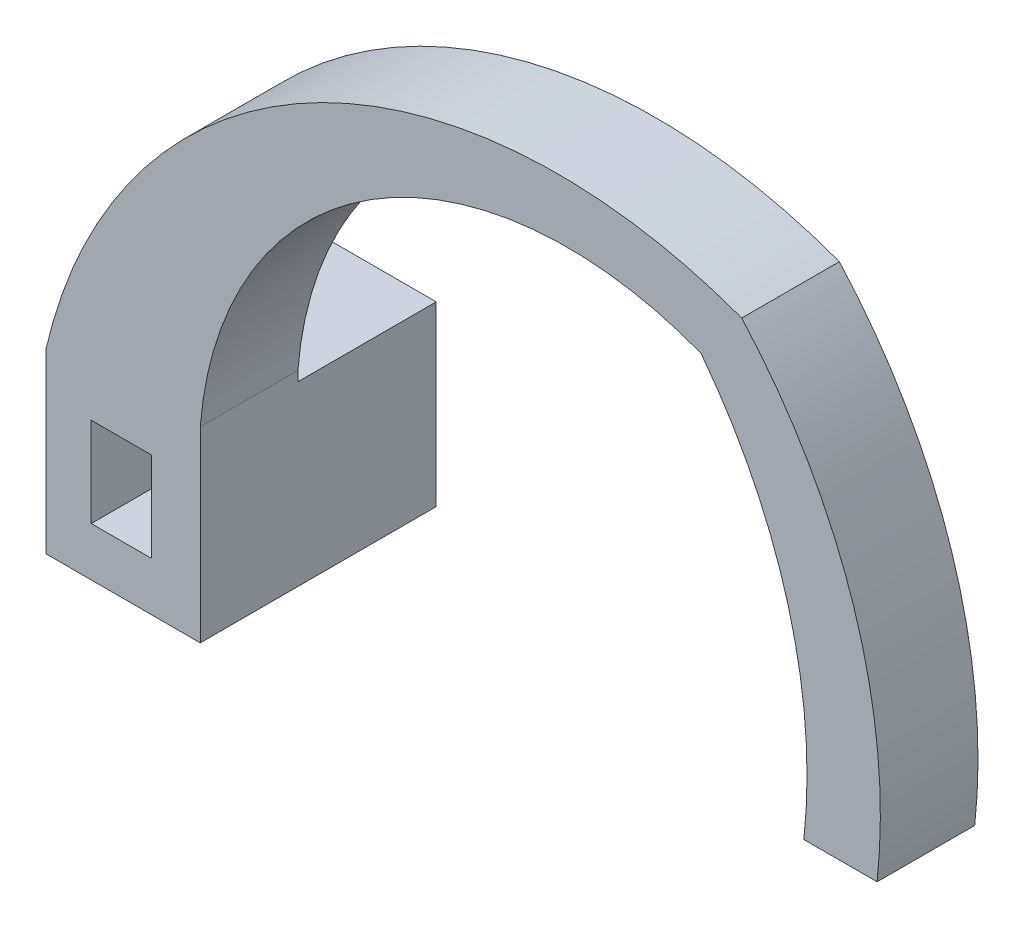
ISO-10303-21;
HEADER;
FILE_DESCRIPTION(('STEP AP214'),'2;1');
FILE_NAME('part.step','',(''),(''),'','','');
FILE_SCHEMA(('AUTOMOTIVE_DESIGN { 1 0 10303 214 1 1 1 1 }'));
ENDSEC;
DATA;
#1=APPLICATION_CONTEXT('core data for automotive mechanical design processes');
#2=APPLICATION_PROTOCOL_DEFINITION('international standard','automotive_design',2000,#1);
#3=PRODUCT_CONTEXT('',#1,'mechanical');
#4=PRODUCT('Part','Part','',(#3));
#5=PRODUCT_RELATED_PRODUCT_CATEGORY('part','',(#4));
#6=PRODUCT_DEFINITION_FORMATION('','',#4);
#7=PRODUCT_DEFINITION_CONTEXT('part definition',#1,'design');
#8=PRODUCT_DEFINITION('design','',#6,#7);
#9=PRODUCT_DEFINITION_SHAPE('','',#8);
#10=(LENGTH_UNIT() NAMED_UNIT(*) SI_UNIT(.MILLI.,.METRE.));
#11=(NAMED_UNIT(*) PLANE_ANGLE_UNIT() SI_UNIT($,.RADIAN.));
#12=(NAMED_UNIT(*) SI_UNIT($,.STERADIAN.) SOLID_ANGLE_UNIT());
#13=UNCERTAINTY_MEASURE_WITH_UNIT(LENGTH_MEASURE(1.E-05),#10,'distance_accuracy_value','');
#14=(GEOMETRIC_REPRESENTATION_CONTEXT(3) GLOBAL_UNCERTAINTY_ASSIGNED_CONTEXT((#13)) GLOBAL_UNIT_ASSIGNED_CONTEXT((#10,
#11,#12)) REPRESENTATION_CONTEXT('',''));
#15=CARTESIAN_POINT('',(0.,0.,0.));
#16=DIRECTION('',(0.,0.,1.));
#17=DIRECTION('',(1.,0.,0.));
#18=AXIS2_PLACEMENT_3D('',#15,#16,#17);
#19=CARTESIAN_POINT('',(26.8654364872377,-2.12640407016159,0.));
#20=DIRECTION('',(0.,0.,-1.));
#21=DIRECTION('',(-1.,0.,0.));
#22=AXIS2_PLACEMENT_3D('',#19,#20,#21);
#23=PLANE('',#22);
#24=DIRECTION('',(0.,1.,0.));
#25=VECTOR('',#24,1.);
#26=CARTESIAN_POINT('',(4.85,5.75,0.));
#27=LINE('',#26,#25);
#28=CARTESIAN_POINT('',(4.85,5.14865988453981,0.));
#29=VERTEX_POINT('',#28);
#30=CARTESIAN_POINT('',(4.85,5.75,0.));
#31=VERTEX_POINT('',#30);
#32=EDGE_CURVE('E141',#29,#31,#27,.T.);
#33=ORIENTED_EDGE('',*,*,#32,.F.);
#34=DIRECTION('',(-1.,0.,0.));
#35=VECTOR('',#34,1.);
#36=CARTESIAN_POINT('',(-4.62898705606322,5.14865988453981,0.));
#37=LINE('',#36,#35);
#38=CARTESIAN_POINT('',(-4.62898705606322,5.14865988453981,0.));
#39=VERTEX_POINT('',#38);
#40=EDGE_CURVE('E187',#29,#39,#37,.T.);
#41=ORIENTED_EDGE('',*,*,#40,.T.);
#42=CARTESIAN_POINT('',(26.8654364872377,-2.12640407016159,0.));
#43=DIRECTION('',(0.,0.,1.));
#44=DIRECTION('',(-1.,0.,0.));
#45=AXIS2_PLACEMENT_3D('',#42,#43,#44);
#46=CIRCLE('',#45,32.3237570506559);
#47=CARTESIAN_POINT('',(38.1232198948608,28.1735560390015,0.));
#48=VERTEX_POINT('',#47);
#49=EDGE_CURVE('E138',#48,#39,#46,.T.);
#50=ORIENTED_EDGE('',*,*,#49,.F.);
#51=CARTESIAN_POINT('',(13.4632041720986,5.97660619916421,0.));
#52=DIRECTION('',(0.,0.,1.));
#53=DIRECTION('',(1.,0.,0.));
#54=AXIS2_PLACEMENT_3D('',#51,#52,#53);
#55=CIRCLE('',#54,33.1786219972911);
#56=CARTESIAN_POINT('',(46.4407893159863,2.32971221705164,0.));
#57=VERTEX_POINT('',#56);
#58=EDGE_CURVE('E86',#57,#48,#55,.T.);
#59=ORIENTED_EDGE('',*,*,#58,.F.);
#60=DIRECTION('',(1.,0.,0.));
#61=VECTOR('',#60,1.);
#62=CARTESIAN_POINT('',(41.93897109,2.32971221705164,0.));
#63=LINE('',#62,#61);
#64=CARTESIAN_POINT('',(41.93897109,2.32971221705162,0.));
#65=VERTEX_POINT('',#64);
#66=EDGE_CURVE('E147',#65,#57,#63,.T.);
#67=ORIENTED_EDGE('',*,*,#66,.F.);
#68=CARTESIAN_POINT('',(10.5957900534776,5.84654599117634,0.));
#69=DIRECTION('',(0.,0.,-1.));
#70=DIRECTION('',(1.,0.,0.));
#71=AXIS2_PLACEMENT_3D('',#68,#69,#70);
#72=CIRCLE('',#71,31.539865524175);
#73=CARTESIAN_POINT('',(35.6198918729963,25.0443960116709,0.));
#74=VERTEX_POINT('',#73);
#75=EDGE_CURVE('E126',#74,#65,#72,.T.);
#76=ORIENTED_EDGE('',*,*,#75,.F.);
#77=CARTESIAN_POINT('',(27.4226515992907,3.93454709283099,0.));
#78=DIRECTION('',(0.,0.,-1.));
#79=DIRECTION('',(-1.,0.,0.));
#80=AXIS2_PLACEMENT_3D('',#77,#78,#79);
#81=CIRCLE('',#80,22.6455397259837);
#82=EDGE_CURVE('E144',#31,#74,#81,.T.);
#83=ORIENTED_EDGE('',*,*,#82,.F.);
#84=EDGE_LOOP('',(#33,#41,#50,#59,#67,#76,#83));
#85=FACE_BOUND('',#84,.T.);
#86=ADVANCED_FACE('F35',(#85),#23,.T.);
#87=CARTESIAN_POINT('',(26.8654364872377,-2.12640407016159,6.));
#88=DIRECTION('',(0.,0.,-1.));
#89=DIRECTION('',(-1.,0.,0.));
#90=AXIS2_PLACEMENT_3D('',#87,#88,#89);
#91=PLANE('',#90);
#92=CARTESIAN_POINT('',(26.8654364872377,-2.12640407016159,6.));
#93=DIRECTION('',(0.,0.,1.));
#94=DIRECTION('',(-1.,0.,0.));
#95=AXIS2_PLACEMENT_3D('',#92,#93,#94);
#96=CIRCLE('',#95,32.3237570506559);
#97=CARTESIAN_POINT('',(38.1232198948608,28.1735560390015,6.));
#98=VERTEX_POINT('',#97);
#99=CARTESIAN_POINT('',(-4.62898705606322,5.14865988453981,6.));
#100=VERTEX_POINT('',#99);
#101=EDGE_CURVE('E150',#98,#100,#96,.T.);
#102=ORIENTED_EDGE('',*,*,#101,.T.);
#103=DIRECTION('',(0.,-1.,0.));
#104=VECTOR('',#103,1.);
#105=CARTESIAN_POINT('',(-4.62898705606323,-5.75,6.));
#106=LINE('',#105,#104);
#107=CARTESIAN_POINT('',(-4.62898705606323,-5.75,6.));
#108=VERTEX_POINT('',#107);
#109=EDGE_CURVE('E94',#100,#108,#106,.T.);
#110=ORIENTED_EDGE('',*,*,#109,.T.);
#111=DIRECTION('',(1.,0.,0.));
#112=VECTOR('',#111,1.);
#113=CARTESIAN_POINT('',(4.85,-5.75,6.));
#114=LINE('',#113,#112);
#115=CARTESIAN_POINT('',(4.85,-5.75,6.));
#116=VERTEX_POINT('',#115);
#117=EDGE_CURVE('E169',#108,#116,#114,.T.);
#118=ORIENTED_EDGE('',*,*,#117,.T.);
#119=DIRECTION('',(0.,1.,0.));
#120=VECTOR('',#119,1.);
#121=CARTESIAN_POINT('',(4.85,5.75,6.));
#122=LINE('',#121,#120);
#123=CARTESIAN_POINT('',(4.85,5.75,6.));
#124=VERTEX_POINT('',#123);
#125=EDGE_CURVE('E224',#116,#124,#122,.T.);
#126=ORIENTED_EDGE('',*,*,#125,.T.);
#127=CARTESIAN_POINT('',(27.4226515992907,3.93454709283099,6.));
#128=DIRECTION('',(0.,0.,-1.));
#129=DIRECTION('',(-1.,0.,0.));
#130=AXIS2_PLACEMENT_3D('',#127,#128,#129);
#131=CIRCLE('',#130,22.6455397259837);
#132=CARTESIAN_POINT('',(35.6198918729963,25.0443960116709,6.));
#133=VERTEX_POINT('',#132);
#134=EDGE_CURVE('E117',#124,#133,#131,.T.);
#135=ORIENTED_EDGE('',*,*,#134,.T.);
#136=CARTESIAN_POINT('',(10.5957900534776,5.84654599117634,6.));
#137=DIRECTION('',(0.,0.,-1.));
#138=DIRECTION('',(1.,0.,0.));
#139=AXIS2_PLACEMENT_3D('',#136,#137,#138);
#140=CIRCLE('',#139,31.539865524175);
#141=CARTESIAN_POINT('',(41.93897109,2.32971221705162,6.));
#142=VERTEX_POINT('',#141);
#143=EDGE_CURVE('E109',#133,#142,#140,.T.);
#144=ORIENTED_EDGE('',*,*,#143,.T.);
#145=DIRECTION('',(1.,0.,0.));
#146=VECTOR('',#145,1.);
#147=CARTESIAN_POINT('',(41.93897109,2.32971221705164,6.));
#148=LINE('',#147,#146);
#149=CARTESIAN_POINT('',(46.4407893159863,2.32971221705164,6.));
#150=VERTEX_POINT('',#149);
#151=EDGE_CURVE('E114',#142,#150,#148,.T.);
#152=ORIENTED_EDGE('',*,*,#151,.T.);
#153=CARTESIAN_POINT('',(13.4632041720986,5.97660619916421,6.));
#154=DIRECTION('',(0.,0.,1.));
#155=DIRECTION('',(1.,0.,0.));
#156=AXIS2_PLACEMENT_3D('',#153,#154,#155);
#157=CIRCLE('',#156,33.1786219972911);
#158=EDGE_CURVE('E59',#150,#98,#157,.T.);
#159=ORIENTED_EDGE('',*,*,#158,.T.);
#160=EDGE_LOOP('',(#102,#110,#118,#126,#135,#144,#152,#159));
#161=FACE_BOUND('',#160,.T.);
#162=DIRECTION('',(0.,-1.,0.));
#163=VECTOR('',#162,1.);
#164=CARTESIAN_POINT('',(-1.85,2.75,6.));
#165=LINE('',#164,#163);
#166=CARTESIAN_POINT('',(-1.85,2.75,6.));
#167=VERTEX_POINT('',#166);
#168=CARTESIAN_POINT('',(-1.85,-2.75,6.));
#169=VERTEX_POINT('',#168);
#170=EDGE_CURVE('E200',#167,#169,#165,.T.);
#171=ORIENTED_EDGE('',*,*,#170,.F.);
#172=DIRECTION('',(-1.,0.,0.));
#173=VECTOR('',#172,1.);
#174=CARTESIAN_POINT('',(-1.85,2.75,6.));
#175=LINE('',#174,#173);
#176=CARTESIAN_POINT('',(1.85,2.75,6.));
#177=VERTEX_POINT('',#176);
#178=EDGE_CURVE('E210',#177,#167,#175,.T.);
#179=ORIENTED_EDGE('',*,*,#178,.F.);
#180=DIRECTION('',(0.,1.,0.));
#181=VECTOR('',#180,1.);
#182=CARTESIAN_POINT('',(1.85,2.75,6.));
#183=LINE('',#182,#181);
#184=CARTESIAN_POINT('',(1.85,-2.75,6.));
#185=VERTEX_POINT('',#184);
#186=EDGE_CURVE('E208',#185,#177,#183,.T.);
#187=ORIENTED_EDGE('',*,*,#186,.F.);
#188=DIRECTION('',(1.,0.,0.));
#189=VECTOR('',#188,1.);
#190=CARTESIAN_POINT('',(-1.85,-2.75,6.));
#191=LINE('',#190,#189);
#192=EDGE_CURVE('E205',#169,#185,#191,.T.);
#193=ORIENTED_EDGE('',*,*,#192,.F.);
#194=EDGE_LOOP('',(#171,#179,#187,#193));
#195=FACE_BOUND('',#194,.T.);
#196=ADVANCED_FACE('F111',(#161,#195),#91,.F.);
#197=CARTESIAN_POINT('',(26.8654364872377,-2.12640407016159,6.));
#198=DIRECTION('',(0.,0.,-1.));
#199=DIRECTION('',(-1.,0.,0.));
#200=AXIS2_PLACEMENT_3D('',#197,#198,#199);
#201=CYLINDRICAL_SURFACE('',#200,32.3237570506559);
#202=ORIENTED_EDGE('',*,*,#49,.T.);
#203=DIRECTION('',(0.,0.,-1.));
#204=VECTOR('',#203,1.);
#205=CARTESIAN_POINT('',(-4.62898705606322,5.14865988453981,6.));
#206=LINE('',#205,#204);
#207=EDGE_CURVE('E11',#100,#39,#206,.T.);
#208=ORIENTED_EDGE('',*,*,#207,.F.);
#209=ORIENTED_EDGE('',*,*,#101,.F.);
#210=DIRECTION('',(0.,0.,-1.));
#211=VECTOR('',#210,1.);
#212=CARTESIAN_POINT('',(38.1232198948608,28.1735560390015,6.));
#213=LINE('',#212,#211);
#214=EDGE_CURVE('E134',#98,#48,#213,.T.);
#215=ORIENTED_EDGE('',*,*,#214,.T.);
#216=EDGE_LOOP('',(#202,#208,#209,#215));
#217=FACE_BOUND('',#216,.T.);
#218=ADVANCED_FACE('F37',(#217),#201,.T.);
#219=CARTESIAN_POINT('',(-4.62898705606323,-5.75,6.));
#220=DIRECTION('',(1.,0.,0.));
#221=DIRECTION('',(0.,1.,0.));
#222=AXIS2_PLACEMENT_3D('',#219,#220,#221);
#223=PLANE('',#222);
#224=ORIENTED_EDGE('',*,*,#207,.T.);
#225=DIRECTION('',(0.,0.,1.));
#226=VECTOR('',#225,1.);
#227=CARTESIAN_POINT('',(-4.62898705606322,5.14865988453981,-8.5));
#228=LINE('',#227,#226);
#229=CARTESIAN_POINT('',(-4.62898705606322,5.14865988453981,-8.5));
#230=VERTEX_POINT('',#229);
#231=EDGE_CURVE('E186',#230,#39,#228,.T.);
#232=ORIENTED_EDGE('',*,*,#231,.F.);
#233=DIRECTION('',(0.,-1.,0.));
#234=VECTOR('',#233,1.);
#235=CARTESIAN_POINT('',(-4.62898705606323,-5.75,-8.5));
#236=LINE('',#235,#234);
#237=CARTESIAN_POINT('',(-4.62898705606323,-5.75,-8.5));
#238=VERTEX_POINT('',#237);
#239=EDGE_CURVE('E179',#230,#238,#236,.T.);
#240=ORIENTED_EDGE('',*,*,#239,.T.);
#241=DIRECTION('',(0.,0.,-1.));
#242=VECTOR('',#241,1.);
#243=CARTESIAN_POINT('',(-4.62898705606323,-5.75,6.));
#244=LINE('',#243,#242);
#245=EDGE_CURVE('E43',#108,#238,#244,.T.);
#246=ORIENTED_EDGE('',*,*,#245,.F.);
#247=ORIENTED_EDGE('',*,*,#109,.F.);
#248=EDGE_LOOP('',(#224,#232,#240,#246,#247));
#249=FACE_BOUND('',#248,.T.);
#250=ADVANCED_FACE('F185',(#249),#223,.F.);
#251=CARTESIAN_POINT('',(4.85,-5.75,6.));
#252=DIRECTION('',(0.,1.,0.));
#253=DIRECTION('',(0.,0.,1.));
#254=AXIS2_PLACEMENT_3D('',#251,#252,#253);
#255=PLANE('',#254);
#256=ORIENTED_EDGE('',*,*,#245,.T.);
#257=DIRECTION('',(1.,0.,0.));
#258=VECTOR('',#257,1.);
#259=CARTESIAN_POINT('',(-4.62898705606323,-5.75,-8.5));
#260=LINE('',#259,#258);
#261=CARTESIAN_POINT('',(4.85,-5.75,-8.5));
#262=VERTEX_POINT('',#261);
#263=EDGE_CURVE('E168',#238,#262,#260,.T.);
#264=ORIENTED_EDGE('',*,*,#263,.T.);
#265=DIRECTION('',(0.,0.,-1.));
#266=VECTOR('',#265,1.);
#267=CARTESIAN_POINT('',(4.85,-5.75,6.));
#268=LINE('',#267,#266);
#269=EDGE_CURVE('E157',#116,#262,#268,.T.);
#270=ORIENTED_EDGE('',*,*,#269,.F.);
#271=ORIENTED_EDGE('',*,*,#117,.F.);
#272=EDGE_LOOP('',(#256,#264,#270,#271));
#273=FACE_BOUND('',#272,.T.);
#274=ADVANCED_FACE('F165',(#273),#255,.F.);
#275=CARTESIAN_POINT('',(4.85,5.75,6.));
#276=DIRECTION('',(-1.,0.,0.));
#277=DIRECTION('',(0.,-1.,0.));
#278=AXIS2_PLACEMENT_3D('',#275,#276,#277);
#279=PLANE('',#278);
#280=ORIENTED_EDGE('',*,*,#269,.T.);
#281=DIRECTION('',(0.,1.,0.));
#282=VECTOR('',#281,1.);
#283=CARTESIAN_POINT('',(4.85,-5.75,-8.5));
#284=LINE('',#283,#282);
#285=CARTESIAN_POINT('',(4.85,5.14865988453981,-8.5));
#286=VERTEX_POINT('',#285);
#287=EDGE_CURVE('E182',#262,#286,#284,.T.);
#288=ORIENTED_EDGE('',*,*,#287,.T.);
#289=DIRECTION('',(0.,0.,1.));
#290=VECTOR('',#289,1.);
#291=CARTESIAN_POINT('',(4.85,5.14865988453981,-8.5));
#292=LINE('',#291,#290);
#293=EDGE_CURVE('E197',#286,#29,#292,.T.);
#294=ORIENTED_EDGE('',*,*,#293,.T.);
#295=ORIENTED_EDGE('',*,*,#32,.T.);
#296=DIRECTION('',(0.,0.,-1.));
#297=VECTOR('',#296,1.);
#298=CARTESIAN_POINT('',(4.85,5.75,6.));
#299=LINE('',#298,#297);
#300=EDGE_CURVE('E154',#124,#31,#299,.T.);
#301=ORIENTED_EDGE('',*,*,#300,.F.);
#302=ORIENTED_EDGE('',*,*,#125,.F.);
#303=EDGE_LOOP('',(#280,#288,#294,#295,#301,#302));
#304=FACE_BOUND('',#303,.T.);
#305=ADVANCED_FACE('F228',(#304),#279,.F.);
#306=CARTESIAN_POINT('',(27.4226515992907,3.93454709283099,6.));
#307=DIRECTION('',(0.,0.,-1.));
#308=DIRECTION('',(-1.,0.,0.));
#309=AXIS2_PLACEMENT_3D('',#306,#307,#308);
#310=CYLINDRICAL_SURFACE('',#309,22.6455397259837);
#311=ORIENTED_EDGE('',*,*,#82,.T.);
#312=DIRECTION('',(0.,0.,-1.));
#313=VECTOR('',#312,1.);
#314=CARTESIAN_POINT('',(35.6198918729963,25.0443960116709,6.));
#315=LINE('',#314,#313);
#316=EDGE_CURVE('E129',#133,#74,#315,.T.);
#317=ORIENTED_EDGE('',*,*,#316,.F.);
#318=ORIENTED_EDGE('',*,*,#134,.F.);
#319=ORIENTED_EDGE('',*,*,#300,.T.);
#320=EDGE_LOOP('',(#311,#317,#318,#319));
#321=FACE_BOUND('',#320,.T.);
#322=ADVANCED_FACE('F232',(#321),#310,.F.);
#323=CARTESIAN_POINT('',(10.5957900534776,5.84654599117634,6.));
#324=DIRECTION('',(0.,0.,-1.));
#325=DIRECTION('',(-1.,0.,0.));
#326=AXIS2_PLACEMENT_3D('',#323,#324,#325);
#327=CYLINDRICAL_SURFACE('',#326,31.539865524175);
#328=ORIENTED_EDGE('',*,*,#75,.T.);
#329=DIRECTION('',(0.,0.,-1.));
#330=VECTOR('',#329,1.);
#331=CARTESIAN_POINT('',(41.93897109,2.32971221705162,6.));
#332=LINE('',#331,#330);
#333=EDGE_CURVE('E123',#142,#65,#332,.T.);
#334=ORIENTED_EDGE('',*,*,#333,.F.);
#335=ORIENTED_EDGE('',*,*,#143,.F.);
#336=ORIENTED_EDGE('',*,*,#316,.T.);
#337=EDGE_LOOP('',(#328,#334,#335,#336));
#338=FACE_BOUND('',#337,.T.);
#339=ADVANCED_FACE('F124',(#338),#327,.F.);
#340=CARTESIAN_POINT('',(41.93897109,2.32971221705164,6.));
#341=DIRECTION('',(0.,1.,0.));
#342=DIRECTION('',(0.,0.,1.));
#343=AXIS2_PLACEMENT_3D('',#340,#341,#342);
#344=PLANE('',#343);
#345=ORIENTED_EDGE('',*,*,#66,.T.);
#346=DIRECTION('',(0.,0.,-1.));
#347=VECTOR('',#346,1.);
#348=CARTESIAN_POINT('',(46.4407893159863,2.32971221705164,6.));
#349=LINE('',#348,#347);
#350=EDGE_CURVE('E130',#150,#57,#349,.T.);
#351=ORIENTED_EDGE('',*,*,#350,.F.);
#352=ORIENTED_EDGE('',*,*,#151,.F.);
#353=ORIENTED_EDGE('',*,*,#333,.T.);
#354=EDGE_LOOP('',(#345,#351,#352,#353));
#355=FACE_BOUND('',#354,.T.);
#356=ADVANCED_FACE('F132',(#355),#344,.F.);
#357=CARTESIAN_POINT('',(13.4632041720986,5.97660619916421,6.));
#358=DIRECTION('',(0.,0.,-1.));
#359=DIRECTION('',(-1.,0.,0.));
#360=AXIS2_PLACEMENT_3D('',#357,#358,#359);
#361=CYLINDRICAL_SURFACE('',#360,33.1786219972911);
#362=ORIENTED_EDGE('',*,*,#58,.T.);
#363=ORIENTED_EDGE('',*,*,#214,.F.);
#364=ORIENTED_EDGE('',*,*,#158,.F.);
#365=ORIENTED_EDGE('',*,*,#350,.T.);
#366=EDGE_LOOP('',(#362,#363,#364,#365));
#367=FACE_BOUND('',#366,.T.);
#368=ADVANCED_FACE('F235',(#367),#361,.T.);
#369=CARTESIAN_POINT('',(-1.85,2.75,6.));
#370=DIRECTION('',(1.,0.,0.));
#371=DIRECTION('',(0.,1.,0.));
#372=AXIS2_PLACEMENT_3D('',#369,#370,#371);
#373=PLANE('',#372);
#374=DIRECTION('',(0.,0.,-1.));
#375=VECTOR('',#374,1.);
#376=CARTESIAN_POINT('',(-1.85,-2.75,6.));
#377=LINE('',#376,#375);
#378=CARTESIAN_POINT('',(-1.85,-2.75,-8.5));
#379=VERTEX_POINT('',#378);
#380=EDGE_CURVE('E142',#169,#379,#377,.T.);
#381=ORIENTED_EDGE('',*,*,#380,.T.);
#382=DIRECTION('',(0.,-1.,0.));
#383=VECTOR('',#382,1.);
#384=CARTESIAN_POINT('',(-1.85,2.75,-8.5));
#385=LINE('',#384,#383);
#386=CARTESIAN_POINT('',(-1.85,2.75,-8.5));
#387=VERTEX_POINT('',#386);
#388=EDGE_CURVE('E268',#387,#379,#385,.T.);
#389=ORIENTED_EDGE('',*,*,#388,.F.);
#390=DIRECTION('',(0.,0.,-1.));
#391=VECTOR('',#390,1.);
#392=CARTESIAN_POINT('',(-1.85,2.75,6.));
#393=LINE('',#392,#391);
#394=EDGE_CURVE('E212',#167,#387,#393,.T.);
#395=ORIENTED_EDGE('',*,*,#394,.F.);
#396=ORIENTED_EDGE('',*,*,#170,.T.);
#397=EDGE_LOOP('',(#381,#389,#395,#396));
#398=FACE_BOUND('',#397,.T.);
#399=ADVANCED_FACE('F266',(#398),#373,.T.);
#400=CARTESIAN_POINT('',(-1.85,-2.75,6.));
#401=DIRECTION('',(0.,1.,0.));
#402=DIRECTION('',(0.,0.,1.));
#403=AXIS2_PLACEMENT_3D('',#400,#401,#402);
#404=PLANE('',#403);
#405=DIRECTION('',(0.,0.,-1.));
#406=VECTOR('',#405,1.);
#407=CARTESIAN_POINT('',(1.85,-2.75,6.));
#408=LINE('',#407,#406);
#409=CARTESIAN_POINT('',(1.85,-2.75,-8.5));
#410=VERTEX_POINT('',#409);
#411=EDGE_CURVE('E216',#185,#410,#408,.T.);
#412=ORIENTED_EDGE('',*,*,#411,.T.);
#413=DIRECTION('',(1.,0.,0.));
#414=VECTOR('',#413,1.);
#415=CARTESIAN_POINT('',(-1.85,-2.75,-8.5));
#416=LINE('',#415,#414);
#417=EDGE_CURVE('E279',#379,#410,#416,.T.);
#418=ORIENTED_EDGE('',*,*,#417,.F.);
#419=ORIENTED_EDGE('',*,*,#380,.F.);
#420=ORIENTED_EDGE('',*,*,#192,.T.);
#421=EDGE_LOOP('',(#412,#418,#419,#420));
#422=FACE_BOUND('',#421,.T.);
#423=ADVANCED_FACE('F277',(#422),#404,.T.);
#424=CARTESIAN_POINT('',(1.85,2.75,6.));
#425=DIRECTION('',(-1.,0.,0.));
#426=DIRECTION('',(0.,0.,1.));
#427=AXIS2_PLACEMENT_3D('',#424,#425,#426);
#428=PLANE('',#427);
#429=DIRECTION('',(0.,0.,-1.));
#430=VECTOR('',#429,1.);
#431=CARTESIAN_POINT('',(1.85,2.75,6.));
#432=LINE('',#431,#430);
#433=CARTESIAN_POINT('',(1.85,2.75,-8.5));
#434=VERTEX_POINT('',#433);
#435=EDGE_CURVE('E50',#177,#434,#432,.T.);
#436=ORIENTED_EDGE('',*,*,#435,.T.);
#437=DIRECTION('',(0.,1.,0.));
#438=VECTOR('',#437,1.);
#439=CARTESIAN_POINT('',(1.85,2.75,-8.5));
#440=LINE('',#439,#438);
#441=EDGE_CURVE('E274',#410,#434,#440,.T.);
#442=ORIENTED_EDGE('',*,*,#441,.F.);
#443=ORIENTED_EDGE('',*,*,#411,.F.);
#444=ORIENTED_EDGE('',*,*,#186,.T.);
#445=EDGE_LOOP('',(#436,#442,#443,#444));
#446=FACE_BOUND('',#445,.T.);
#447=ADVANCED_FACE('F271',(#446),#428,.T.);
#448=CARTESIAN_POINT('',(-1.85,2.75,6.));
#449=DIRECTION('',(0.,-1.,0.));
#450=DIRECTION('',(0.,0.,-1.));
#451=AXIS2_PLACEMENT_3D('',#448,#449,#450);
#452=PLANE('',#451);
#453=ORIENTED_EDGE('',*,*,#394,.T.);
#454=DIRECTION('',(-1.,0.,0.));
#455=VECTOR('',#454,1.);
#456=CARTESIAN_POINT('',(-1.85,2.75,-8.5));
#457=LINE('',#456,#455);
#458=EDGE_CURVE('E190',#434,#387,#457,.T.);
#459=ORIENTED_EDGE('',*,*,#458,.F.);
#460=ORIENTED_EDGE('',*,*,#435,.F.);
#461=ORIENTED_EDGE('',*,*,#178,.T.);
#462=EDGE_LOOP('',(#453,#459,#460,#461));
#463=FACE_BOUND('',#462,.T.);
#464=ADVANCED_FACE('F261',(#463),#452,.T.);
#465=CARTESIAN_POINT('',(-4.62898705606322,5.14865988453981,-8.5));
#466=DIRECTION('',(0.,1.,0.));
#467=DIRECTION('',(0.,0.,1.));
#468=AXIS2_PLACEMENT_3D('',#465,#466,#467);
#469=PLANE('',#468);
#470=ORIENTED_EDGE('',*,*,#40,.F.);
#471=ORIENTED_EDGE('',*,*,#293,.F.);
#472=DIRECTION('',(-1.,0.,0.));
#473=VECTOR('',#472,1.);
#474=CARTESIAN_POINT('',(-4.62898705606322,5.14865988453981,-8.5));
#475=LINE('',#474,#473);
#476=EDGE_CURVE('E196',#286,#230,#475,.T.);
#477=ORIENTED_EDGE('',*,*,#476,.T.);
#478=ORIENTED_EDGE('',*,*,#231,.T.);
#479=EDGE_LOOP('',(#470,#471,#477,#478));
#480=FACE_BOUND('',#479,.T.);
#481=ADVANCED_FACE('F242',(#480),#469,.T.);
#482=CARTESIAN_POINT('',(0.,0.,-8.5));
#483=DIRECTION('',(0.,0.,-1.));
#484=DIRECTION('',(-1.,0.,0.));
#485=AXIS2_PLACEMENT_3D('',#482,#483,#484);
#486=PLANE('',#485);
#487=ORIENTED_EDGE('',*,*,#388,.T.);
#488=ORIENTED_EDGE('',*,*,#417,.T.);
#489=ORIENTED_EDGE('',*,*,#441,.T.);
#490=ORIENTED_EDGE('',*,*,#458,.T.);
#491=EDGE_LOOP('',(#487,#488,#489,#490));
#492=FACE_BOUND('',#491,.T.);
#493=ORIENTED_EDGE('',*,*,#239,.F.);
#494=ORIENTED_EDGE('',*,*,#476,.F.);
#495=ORIENTED_EDGE('',*,*,#287,.F.);
#496=ORIENTED_EDGE('',*,*,#263,.F.);
#497=EDGE_LOOP('',(#493,#494,#495,#496));
#498=FACE_BOUND('',#497,.T.);
#499=ADVANCED_FACE('F176',(#492,#498),#486,.T.);
#500=CLOSED_SHELL('',(#86,#196,#218,#250,#274,#305,#322,#339,#356,#368,#399,#423,#447,#464,#481,#499));
#501=MANIFOLD_SOLID_BREP('B2',#500);
#502=ADVANCED_BREP_SHAPE_REPRESENTATION('',(#18,#501),#14);
#503=SHAPE_DEFINITION_REPRESENTATION(#9,#502);
ENDSEC;
END-ISO-10303-21;
